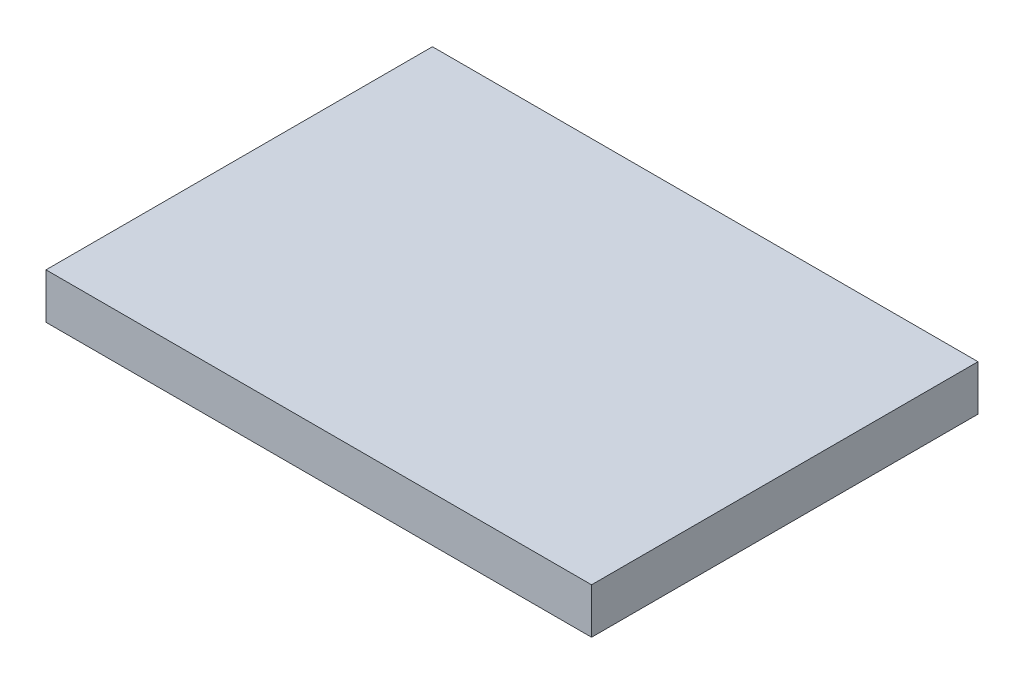
ISO-10303-21;
HEADER;
FILE_DESCRIPTION(('STEP AP214'),'2;1');
FILE_NAME('part.step','',(''),(''),'','','');
FILE_SCHEMA(('AUTOMOTIVE_DESIGN { 1 0 10303 214 1 1 1 1 }'));
ENDSEC;
DATA;
#1=APPLICATION_CONTEXT('core data for automotive mechanical design processes');
#2=APPLICATION_PROTOCOL_DEFINITION('international standard','automotive_design',2000,#1);
#3=PRODUCT_CONTEXT('',#1,'mechanical');
#4=PRODUCT('Part','Part','',(#3));
#5=PRODUCT_RELATED_PRODUCT_CATEGORY('part','',(#4));
#6=PRODUCT_DEFINITION_FORMATION('','',#4);
#7=PRODUCT_DEFINITION_CONTEXT('part definition',#1,'design');
#8=PRODUCT_DEFINITION('design','',#6,#7);
#9=PRODUCT_DEFINITION_SHAPE('','',#8);
#10=(LENGTH_UNIT() NAMED_UNIT(*) SI_UNIT(.MILLI.,.METRE.));
#11=(NAMED_UNIT(*) PLANE_ANGLE_UNIT() SI_UNIT($,.RADIAN.));
#12=(NAMED_UNIT(*) SI_UNIT($,.STERADIAN.) SOLID_ANGLE_UNIT());
#13=UNCERTAINTY_MEASURE_WITH_UNIT(LENGTH_MEASURE(1.E-05),#10,'distance_accuracy_value','');
#14=(GEOMETRIC_REPRESENTATION_CONTEXT(3) GLOBAL_UNCERTAINTY_ASSIGNED_CONTEXT((#13)) GLOBAL_UNIT_ASSIGNED_CONTEXT((#10,
#11,#12)) REPRESENTATION_CONTEXT('',''));
#15=CARTESIAN_POINT('',(0.,0.,0.));
#16=DIRECTION('',(0.,0.,1.));
#17=DIRECTION('',(1.,0.,0.));
#18=AXIS2_PLACEMENT_3D('',#15,#16,#17);
#19=CARTESIAN_POINT('',(0.,2.54,0.));
#20=DIRECTION('',(1.,0.,0.));
#21=DIRECTION('',(0.,0.,-1.));
#22=AXIS2_PLACEMENT_3D('',#19,#20,#21);
#23=PLANE('',#22);
#24=DIRECTION('',(0.,0.,1.));
#25=VECTOR('',#24,1.);
#26=CARTESIAN_POINT('',(0.,0.,0.));
#27=LINE('',#26,#25);
#28=CARTESIAN_POINT('',(0.,0.,-21.59));
#29=VERTEX_POINT('',#28);
#30=CARTESIAN_POINT('',(0.,0.,0.));
#31=VERTEX_POINT('',#30);
#32=EDGE_CURVE('E96',#29,#31,#27,.T.);
#33=ORIENTED_EDGE('',*,*,#32,.T.);
#34=DIRECTION('',(0.,-1.,0.));
#35=VECTOR('',#34,1.);
#36=CARTESIAN_POINT('',(0.,2.54,0.));
#37=LINE('',#36,#35);
#38=CARTESIAN_POINT('',(0.,2.54,0.));
#39=VERTEX_POINT('',#38);
#40=EDGE_CURVE('E11',#39,#31,#37,.T.);
#41=ORIENTED_EDGE('',*,*,#40,.F.);
#42=DIRECTION('',(0.,0.,1.));
#43=VECTOR('',#42,1.);
#44=CARTESIAN_POINT('',(0.,2.54,0.));
#45=LINE('',#44,#43);
#46=CARTESIAN_POINT('',(0.,2.54,-21.59));
#47=VERTEX_POINT('',#46);
#48=EDGE_CURVE('E84',#47,#39,#45,.T.);
#49=ORIENTED_EDGE('',*,*,#48,.F.);
#50=DIRECTION('',(0.,-1.,0.));
#51=VECTOR('',#50,1.);
#52=CARTESIAN_POINT('',(0.,2.54,-21.59));
#53=LINE('',#52,#51);
#54=EDGE_CURVE('E92',#47,#29,#53,.T.);
#55=ORIENTED_EDGE('',*,*,#54,.T.);
#56=EDGE_LOOP('',(#33,#41,#49,#55));
#57=FACE_BOUND('',#56,.T.);
#58=ADVANCED_FACE('F33',(#57),#23,.F.);
#59=CARTESIAN_POINT('',(0.,2.54,0.));
#60=DIRECTION('',(0.,0.,-1.));
#61=DIRECTION('',(-1.,0.,0.));
#62=AXIS2_PLACEMENT_3D('',#59,#60,#61);
#63=PLANE('',#62);
#64=DIRECTION('',(1.,0.,0.));
#65=VECTOR('',#64,1.);
#66=CARTESIAN_POINT('',(0.,0.,0.));
#67=LINE('',#66,#65);
#68=CARTESIAN_POINT('',(30.48,0.,0.));
#69=VERTEX_POINT('',#68);
#70=EDGE_CURVE('E88',#31,#69,#67,.T.);
#71=ORIENTED_EDGE('',*,*,#70,.T.);
#72=DIRECTION('',(0.,-1.,0.));
#73=VECTOR('',#72,1.);
#74=CARTESIAN_POINT('',(30.48,2.54,0.));
#75=LINE('',#74,#73);
#76=CARTESIAN_POINT('',(30.48,2.54,0.));
#77=VERTEX_POINT('',#76);
#78=EDGE_CURVE('E41',#77,#69,#75,.T.);
#79=ORIENTED_EDGE('',*,*,#78,.F.);
#80=DIRECTION('',(1.,0.,0.));
#81=VECTOR('',#80,1.);
#82=CARTESIAN_POINT('',(0.,2.54,0.));
#83=LINE('',#82,#81);
#84=EDGE_CURVE('E79',#39,#77,#83,.T.);
#85=ORIENTED_EDGE('',*,*,#84,.F.);
#86=ORIENTED_EDGE('',*,*,#40,.T.);
#87=EDGE_LOOP('',(#71,#79,#85,#86));
#88=FACE_BOUND('',#87,.T.);
#89=ADVANCED_FACE('F87',(#88),#63,.F.);
#90=CARTESIAN_POINT('',(30.48,2.54,0.));
#91=DIRECTION('',(-1.,0.,0.));
#92=DIRECTION('',(0.,0.,1.));
#93=AXIS2_PLACEMENT_3D('',#90,#91,#92);
#94=PLANE('',#93);
#95=DIRECTION('',(0.,0.,-1.));
#96=VECTOR('',#95,1.);
#97=CARTESIAN_POINT('',(30.48,0.,0.));
#98=LINE('',#97,#96);
#99=CARTESIAN_POINT('',(30.48,0.,-21.59));
#100=VERTEX_POINT('',#99);
#101=EDGE_CURVE('E66',#69,#100,#98,.T.);
#102=ORIENTED_EDGE('',*,*,#101,.T.);
#103=DIRECTION('',(0.,-1.,0.));
#104=VECTOR('',#103,1.);
#105=CARTESIAN_POINT('',(30.48,2.54,-21.59));
#106=LINE('',#105,#104);
#107=CARTESIAN_POINT('',(30.48,2.54,-21.59));
#108=VERTEX_POINT('',#107);
#109=EDGE_CURVE('E89',#108,#100,#106,.T.);
#110=ORIENTED_EDGE('',*,*,#109,.F.);
#111=DIRECTION('',(0.,0.,-1.));
#112=VECTOR('',#111,1.);
#113=CARTESIAN_POINT('',(30.48,2.54,0.));
#114=LINE('',#113,#112);
#115=EDGE_CURVE('E82',#77,#108,#114,.T.);
#116=ORIENTED_EDGE('',*,*,#115,.F.);
#117=ORIENTED_EDGE('',*,*,#78,.T.);
#118=EDGE_LOOP('',(#102,#110,#116,#117));
#119=FACE_BOUND('',#118,.T.);
#120=ADVANCED_FACE('F90',(#119),#94,.F.);
#121=CARTESIAN_POINT('',(0.,2.54,-21.59));
#122=DIRECTION('',(0.,0.,1.));
#123=DIRECTION('',(1.,0.,0.));
#124=AXIS2_PLACEMENT_3D('',#121,#122,#123);
#125=PLANE('',#124);
#126=DIRECTION('',(-1.,0.,0.));
#127=VECTOR('',#126,1.);
#128=CARTESIAN_POINT('',(0.,0.,-21.59));
#129=LINE('',#128,#127);
#130=EDGE_CURVE('E72',#100,#29,#129,.T.);
#131=ORIENTED_EDGE('',*,*,#130,.T.);
#132=ORIENTED_EDGE('',*,*,#54,.F.);
#133=DIRECTION('',(-1.,0.,0.));
#134=VECTOR('',#133,1.);
#135=CARTESIAN_POINT('',(0.,2.54,-21.59));
#136=LINE('',#135,#134);
#137=EDGE_CURVE('E49',#108,#47,#136,.T.);
#138=ORIENTED_EDGE('',*,*,#137,.F.);
#139=ORIENTED_EDGE('',*,*,#109,.T.);
#140=EDGE_LOOP('',(#131,#132,#138,#139));
#141=FACE_BOUND('',#140,.T.);
#142=ADVANCED_FACE('F103',(#141),#125,.F.);
#143=CARTESIAN_POINT('',(0.,2.54,0.));
#144=DIRECTION('',(0.,-1.,0.));
#145=DIRECTION('',(0.,0.,-1.));
#146=AXIS2_PLACEMENT_3D('',#143,#144,#145);
#147=PLANE('',#146);
#148=ORIENTED_EDGE('',*,*,#48,.T.);
#149=ORIENTED_EDGE('',*,*,#84,.T.);
#150=ORIENTED_EDGE('',*,*,#115,.T.);
#151=ORIENTED_EDGE('',*,*,#137,.T.);
#152=EDGE_LOOP('',(#148,#149,#150,#151));
#153=FACE_BOUND('',#152,.T.);
#154=ADVANCED_FACE('F80',(#153),#147,.F.);
#155=CARTESIAN_POINT('',(0.,0.,0.));
#156=DIRECTION('',(0.,-1.,0.));
#157=DIRECTION('',(0.,0.,-1.));
#158=AXIS2_PLACEMENT_3D('',#155,#156,#157);
#159=PLANE('',#158);
#160=ORIENTED_EDGE('',*,*,#32,.F.);
#161=ORIENTED_EDGE('',*,*,#130,.F.);
#162=ORIENTED_EDGE('',*,*,#101,.F.);
#163=ORIENTED_EDGE('',*,*,#70,.F.);
#164=EDGE_LOOP('',(#160,#161,#162,#163));
#165=FACE_BOUND('',#164,.T.);
#166=ADVANCED_FACE('F106',(#165),#159,.T.);
#167=CLOSED_SHELL('',(#58,#89,#120,#142,#154,#166));
#168=MANIFOLD_SOLID_BREP('B2',#167);
#169=ADVANCED_BREP_SHAPE_REPRESENTATION('',(#18,#168),#14);
#170=SHAPE_DEFINITION_REPRESENTATION(#9,#169);
ENDSEC;
END-ISO-10303-21;
